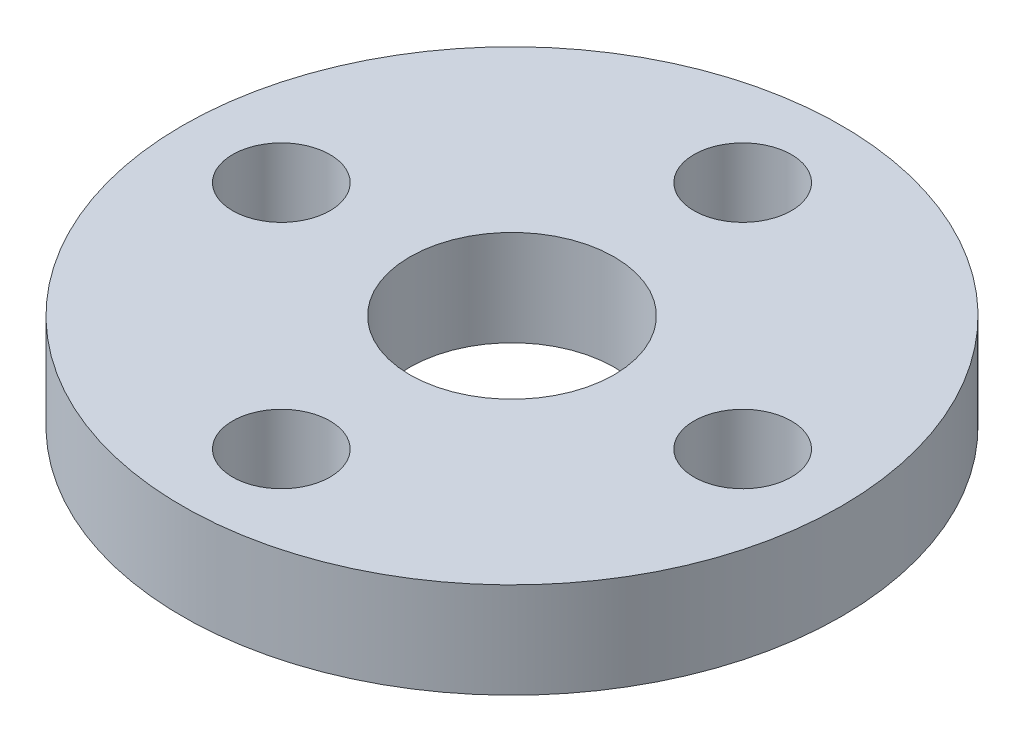
ISO-10303-21;
HEADER;
FILE_DESCRIPTION(('STEP AP214'),'2;1');
FILE_NAME('part.step','',(''),(''),'','','');
FILE_SCHEMA(('AUTOMOTIVE_DESIGN { 1 0 10303 214 1 1 1 1 }'));
ENDSEC;
DATA;
#1=APPLICATION_CONTEXT('core data for automotive mechanical design processes');
#2=APPLICATION_PROTOCOL_DEFINITION('international standard','automotive_design',2000,#1);
#3=PRODUCT_CONTEXT('',#1,'mechanical');
#4=PRODUCT('Part','Part','',(#3));
#5=PRODUCT_RELATED_PRODUCT_CATEGORY('part','',(#4));
#6=PRODUCT_DEFINITION_FORMATION('','',#4);
#7=PRODUCT_DEFINITION_CONTEXT('part definition',#1,'design');
#8=PRODUCT_DEFINITION('design','',#6,#7);
#9=PRODUCT_DEFINITION_SHAPE('','',#8);
#10=(LENGTH_UNIT() NAMED_UNIT(*) SI_UNIT(.MILLI.,.METRE.));
#11=(NAMED_UNIT(*) PLANE_ANGLE_UNIT() SI_UNIT($,.RADIAN.));
#12=(NAMED_UNIT(*) SI_UNIT($,.STERADIAN.) SOLID_ANGLE_UNIT());
#13=UNCERTAINTY_MEASURE_WITH_UNIT(LENGTH_MEASURE(1.E-05),#10,'distance_accuracy_value','');
#14=(GEOMETRIC_REPRESENTATION_CONTEXT(3) GLOBAL_UNCERTAINTY_ASSIGNED_CONTEXT((#13)) GLOBAL_UNIT_ASSIGNED_CONTEXT((#10,
#11,#12)) REPRESENTATION_CONTEXT('',''));
#15=CARTESIAN_POINT('',(0.,0.,0.));
#16=DIRECTION('',(0.,0.,1.));
#17=DIRECTION('',(1.,0.,0.));
#18=AXIS2_PLACEMENT_3D('',#15,#16,#17);
#19=CARTESIAN_POINT('',(-45.,142.35,13.5));
#20=DIRECTION('',(0.,-1.,0.));
#21=DIRECTION('',(0.,0.,1.));
#22=AXIS2_PLACEMENT_3D('',#19,#20,#21);
#23=PLANE('',#22);
#24=CARTESIAN_POINT('',(-38.,142.35,10.));
#25=DIRECTION('',(0.,-1.,0.));
#26=DIRECTION('',(0.,0.,-1.));
#27=AXIS2_PLACEMENT_3D('',#24,#25,#26);
#28=CIRCLE('',#27,1.47782604588);
#29=CARTESIAN_POINT('',(-38.,142.35,8.52217395412));
#30=VERTEX_POINT('',#29);
#31=EDGE_CURVE('E10',#30,#30,#28,.F.);
#32=ORIENTED_EDGE('',*,*,#31,.T.);
#33=EDGE_LOOP('',(#32));
#34=FACE_BOUND('',#33,.T.);
#35=CARTESIAN_POINT('',(-45.,142.35,2.99999999999994));
#36=DIRECTION('',(0.,-1.,0.));
#37=DIRECTION('',(-1.,0.,0.));
#38=AXIS2_PLACEMENT_3D('',#35,#36,#37);
#39=CIRCLE('',#38,1.47782604588);
#40=CARTESIAN_POINT('',(-46.47782604588,142.35,2.99999999999994));
#41=VERTEX_POINT('',#40);
#42=EDGE_CURVE('E24',#41,#41,#39,.F.);
#43=ORIENTED_EDGE('',*,*,#42,.T.);
#44=EDGE_LOOP('',(#43));
#45=FACE_BOUND('',#44,.T.);
#46=CARTESIAN_POINT('',(-52.,142.35,10.));
#47=DIRECTION('',(0.,1.,0.));
#48=DIRECTION('',(0.,0.,1.));
#49=AXIS2_PLACEMENT_3D('',#46,#47,#48);
#50=CIRCLE('',#49,1.47782604588);
#51=CARTESIAN_POINT('',(-52.,142.35,11.47782604588));
#52=VERTEX_POINT('',#51);
#53=EDGE_CURVE('E34',#52,#52,#50,.F.);
#54=ORIENTED_EDGE('',*,*,#53,.F.);
#55=EDGE_LOOP('',(#54));
#56=FACE_BOUND('',#55,.T.);
#57=CARTESIAN_POINT('',(-45.,142.35,17.));
#58=DIRECTION('',(0.,-1.,0.));
#59=DIRECTION('',(1.,0.,0.));
#60=AXIS2_PLACEMENT_3D('',#57,#58,#59);
#61=CIRCLE('',#60,1.47782604588);
#62=CARTESIAN_POINT('',(-43.52217395412,142.35,17.));
#63=VERTEX_POINT('',#62);
#64=EDGE_CURVE('E64',#63,#63,#61,.F.);
#65=ORIENTED_EDGE('',*,*,#64,.T.);
#66=EDGE_LOOP('',(#65));
#67=FACE_BOUND('',#66,.T.);
#68=CARTESIAN_POINT('',(-45.,142.35,10.));
#69=DIRECTION('',(0.,1.,0.));
#70=DIRECTION('',(1.,0.,0.));
#71=AXIS2_PLACEMENT_3D('',#68,#69,#70);
#72=CIRCLE('',#71,10.);
#73=CARTESIAN_POINT('',(-35.,142.35,10.));
#74=VERTEX_POINT('',#73);
#75=EDGE_CURVE('E58',#74,#74,#72,.F.);
#76=ORIENTED_EDGE('',*,*,#75,.T.);
#77=EDGE_LOOP('',(#76));
#78=FACE_BOUND('',#77,.T.);
#79=CARTESIAN_POINT('',(-45.,142.35,10.));
#80=DIRECTION('',(0.,1.,0.));
#81=DIRECTION('',(0.,0.,1.));
#82=AXIS2_PLACEMENT_3D('',#79,#80,#81);
#83=CIRCLE('',#82,3.1);
#84=CARTESIAN_POINT('',(-45.,142.35,13.1));
#85=VERTEX_POINT('',#84);
#86=EDGE_CURVE('E73',#85,#85,#83,.T.);
#87=ORIENTED_EDGE('',*,*,#86,.T.);
#88=EDGE_LOOP('',(#87));
#89=FACE_BOUND('',#88,.T.);
#90=ADVANCED_FACE('F15',(#34,#45,#56,#67,#78,#89),#23,.T.);
#91=CARTESIAN_POINT('',(-45.,145.25,13.5));
#92=DIRECTION('',(0.,-1.,0.));
#93=DIRECTION('',(0.,0.,1.));
#94=AXIS2_PLACEMENT_3D('',#91,#92,#93);
#95=PLANE('',#94);
#96=CARTESIAN_POINT('',(-38.,145.25,10.));
#97=DIRECTION('',(0.,-1.,0.));
#98=DIRECTION('',(0.,0.,-1.));
#99=AXIS2_PLACEMENT_3D('',#96,#97,#98);
#100=CIRCLE('',#99,1.47782604588);
#101=CARTESIAN_POINT('',(-38.,145.25,8.52217395412));
#102=VERTEX_POINT('',#101);
#103=EDGE_CURVE('E19',#102,#102,#100,.F.);
#104=ORIENTED_EDGE('',*,*,#103,.F.);
#105=EDGE_LOOP('',(#104));
#106=FACE_BOUND('',#105,.T.);
#107=CARTESIAN_POINT('',(-45.,145.25,2.99999999999994));
#108=DIRECTION('',(0.,-1.,0.));
#109=DIRECTION('',(-1.,0.,0.));
#110=AXIS2_PLACEMENT_3D('',#107,#108,#109);
#111=CIRCLE('',#110,1.47782604588);
#112=CARTESIAN_POINT('',(-46.47782604588,145.25,2.99999999999994));
#113=VERTEX_POINT('',#112);
#114=EDGE_CURVE('E49',#113,#113,#111,.F.);
#115=ORIENTED_EDGE('',*,*,#114,.F.);
#116=EDGE_LOOP('',(#115));
#117=FACE_BOUND('',#116,.T.);
#118=CARTESIAN_POINT('',(-52.,145.25,10.));
#119=DIRECTION('',(0.,1.,0.));
#120=DIRECTION('',(0.,0.,1.));
#121=AXIS2_PLACEMENT_3D('',#118,#119,#120);
#122=CIRCLE('',#121,1.47782604588);
#123=CARTESIAN_POINT('',(-52.,145.25,11.47782604588));
#124=VERTEX_POINT('',#123);
#125=EDGE_CURVE('E46',#124,#124,#122,.F.);
#126=ORIENTED_EDGE('',*,*,#125,.T.);
#127=EDGE_LOOP('',(#126));
#128=FACE_BOUND('',#127,.T.);
#129=CARTESIAN_POINT('',(-45.,145.25,17.));
#130=DIRECTION('',(0.,-1.,0.));
#131=DIRECTION('',(1.,0.,0.));
#132=AXIS2_PLACEMENT_3D('',#129,#130,#131);
#133=CIRCLE('',#132,1.47782604588);
#134=CARTESIAN_POINT('',(-43.52217395412,145.25,17.));
#135=VERTEX_POINT('',#134);
#136=EDGE_CURVE('E41',#135,#135,#133,.F.);
#137=ORIENTED_EDGE('',*,*,#136,.F.);
#138=EDGE_LOOP('',(#137));
#139=FACE_BOUND('',#138,.T.);
#140=CARTESIAN_POINT('',(-45.,145.25,10.));
#141=DIRECTION('',(0.,1.,0.));
#142=DIRECTION('',(1.,0.,0.));
#143=AXIS2_PLACEMENT_3D('',#140,#141,#142);
#144=CIRCLE('',#143,10.);
#145=CARTESIAN_POINT('',(-35.,145.25,10.));
#146=VERTEX_POINT('',#145);
#147=EDGE_CURVE('E38',#146,#146,#144,.F.);
#148=ORIENTED_EDGE('',*,*,#147,.F.);
#149=EDGE_LOOP('',(#148));
#150=FACE_BOUND('',#149,.T.);
#151=CARTESIAN_POINT('',(-45.,145.25,10.));
#152=DIRECTION('',(0.,-1.,0.));
#153=DIRECTION('',(1.,0.,0.));
#154=AXIS2_PLACEMENT_3D('',#151,#152,#153);
#155=CIRCLE('',#154,3.1);
#156=CARTESIAN_POINT('',(-41.9,145.25,10.));
#157=VERTEX_POINT('',#156);
#158=EDGE_CURVE('E42',#157,#157,#155,.F.);
#159=ORIENTED_EDGE('',*,*,#158,.F.);
#160=EDGE_LOOP('',(#159));
#161=FACE_BOUND('',#160,.T.);
#162=ADVANCED_FACE('F85',(#106,#117,#128,#139,#150,#161),#95,.F.);
#163=CARTESIAN_POINT('',(-45.,142.35,2.99999999999994));
#164=DIRECTION('',(0.,1.,0.));
#165=DIRECTION('',(0.,0.,-1.));
#166=AXIS2_PLACEMENT_3D('',#163,#164,#165);
#167=CYLINDRICAL_SURFACE('',#166,1.47782604588);
#168=ORIENTED_EDGE('',*,*,#42,.F.);
#169=EDGE_LOOP('',(#168));
#170=FACE_BOUND('',#169,.T.);
#171=ORIENTED_EDGE('',*,*,#114,.T.);
#172=EDGE_LOOP('',(#171));
#173=FACE_BOUND('',#172,.T.);
#174=ADVANCED_FACE('F101',(#170,#173),#167,.F.);
#175=CARTESIAN_POINT('',(-52.,142.35,10.));
#176=DIRECTION('',(0.,1.,0.));
#177=DIRECTION('',(0.,0.,-1.));
#178=AXIS2_PLACEMENT_3D('',#175,#176,#177);
#179=CYLINDRICAL_SURFACE('',#178,1.47782604588);
#180=ORIENTED_EDGE('',*,*,#53,.T.);
#181=EDGE_LOOP('',(#180));
#182=FACE_BOUND('',#181,.T.);
#183=ORIENTED_EDGE('',*,*,#125,.F.);
#184=EDGE_LOOP('',(#183));
#185=FACE_BOUND('',#184,.T.);
#186=ADVANCED_FACE('F80',(#182,#185),#179,.F.);
#187=CARTESIAN_POINT('',(-45.,142.35,17.));
#188=DIRECTION('',(0.,1.,0.));
#189=DIRECTION('',(0.,0.,-1.));
#190=AXIS2_PLACEMENT_3D('',#187,#188,#189);
#191=CYLINDRICAL_SURFACE('',#190,1.47782604588);
#192=ORIENTED_EDGE('',*,*,#64,.F.);
#193=EDGE_LOOP('',(#192));
#194=FACE_BOUND('',#193,.T.);
#195=ORIENTED_EDGE('',*,*,#136,.T.);
#196=EDGE_LOOP('',(#195));
#197=FACE_BOUND('',#196,.T.);
#198=ADVANCED_FACE('F118',(#194,#197),#191,.F.);
#199=CARTESIAN_POINT('',(-45.,142.35,10.));
#200=DIRECTION('',(0.,1.,0.));
#201=DIRECTION('',(0.,0.,-1.));
#202=AXIS2_PLACEMENT_3D('',#199,#200,#201);
#203=CYLINDRICAL_SURFACE('',#202,10.);
#204=ORIENTED_EDGE('',*,*,#75,.F.);
#205=EDGE_LOOP('',(#204));
#206=FACE_BOUND('',#205,.T.);
#207=ORIENTED_EDGE('',*,*,#147,.T.);
#208=EDGE_LOOP('',(#207));
#209=FACE_BOUND('',#208,.T.);
#210=ADVANCED_FACE('F17',(#206,#209),#203,.T.);
#211=CARTESIAN_POINT('',(-38.,142.35,10.));
#212=DIRECTION('',(0.,1.,0.));
#213=DIRECTION('',(0.,0.,-1.));
#214=AXIS2_PLACEMENT_3D('',#211,#212,#213);
#215=CYLINDRICAL_SURFACE('',#214,1.47782604588);
#216=ORIENTED_EDGE('',*,*,#31,.F.);
#217=EDGE_LOOP('',(#216));
#218=FACE_BOUND('',#217,.T.);
#219=ORIENTED_EDGE('',*,*,#103,.T.);
#220=EDGE_LOOP('',(#219));
#221=FACE_BOUND('',#220,.T.);
#222=ADVANCED_FACE('F113',(#218,#221),#215,.F.);
#223=CARTESIAN_POINT('',(-45.,142.06,10.));
#224=DIRECTION('',(0.,1.,0.));
#225=DIRECTION('',(0.,0.,-1.));
#226=AXIS2_PLACEMENT_3D('',#223,#224,#225);
#227=CYLINDRICAL_SURFACE('',#226,3.1);
#228=ORIENTED_EDGE('',*,*,#158,.T.);
#229=EDGE_LOOP('',(#228));
#230=FACE_BOUND('',#229,.T.);
#231=ORIENTED_EDGE('',*,*,#86,.F.);
#232=EDGE_LOOP('',(#231));
#233=FACE_BOUND('',#232,.T.);
#234=ADVANCED_FACE('F98',(#230,#233),#227,.F.);
#235=CLOSED_SHELL('',(#90,#162,#174,#186,#198,#210,#222,#234));
#236=MANIFOLD_SOLID_BREP('B1',#235);
#237=ADVANCED_BREP_SHAPE_REPRESENTATION('',(#18,#236),#14);
#238=SHAPE_DEFINITION_REPRESENTATION(#9,#237);
ENDSEC;
END-ISO-10303-21;
